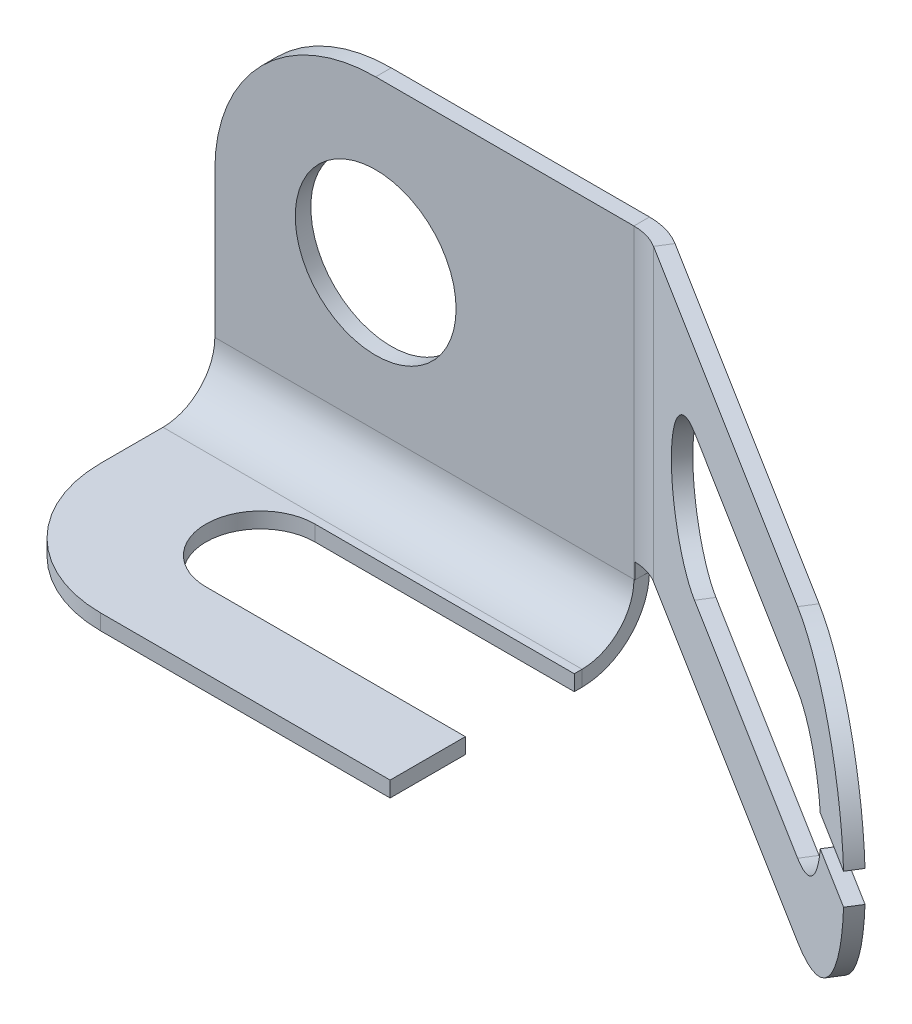
ISO-10303-21;
HEADER;
FILE_DESCRIPTION(('STEP AP214'),'2;1');
FILE_NAME('part.step','',(''),(''),'','','');
FILE_SCHEMA(('AUTOMOTIVE_DESIGN { 1 0 10303 214 1 1 1 1 }'));
ENDSEC;
DATA;
#1=APPLICATION_CONTEXT('core data for automotive mechanical design processes');
#2=APPLICATION_PROTOCOL_DEFINITION('international standard','automotive_design',2000,#1);
#3=PRODUCT_CONTEXT('',#1,'mechanical');
#4=PRODUCT('Part','Part','',(#3));
#5=PRODUCT_RELATED_PRODUCT_CATEGORY('part','',(#4));
#6=PRODUCT_DEFINITION_FORMATION('','',#4);
#7=PRODUCT_DEFINITION_CONTEXT('part definition',#1,'design');
#8=PRODUCT_DEFINITION('design','',#6,#7);
#9=PRODUCT_DEFINITION_SHAPE('','',#8);
#10=(LENGTH_UNIT() NAMED_UNIT(*) SI_UNIT(.MILLI.,.METRE.));
#11=(NAMED_UNIT(*) PLANE_ANGLE_UNIT() SI_UNIT($,.RADIAN.));
#12=(NAMED_UNIT(*) SI_UNIT($,.STERADIAN.) SOLID_ANGLE_UNIT());
#13=UNCERTAINTY_MEASURE_WITH_UNIT(LENGTH_MEASURE(1.E-05),#10,'distance_accuracy_value','');
#14=(GEOMETRIC_REPRESENTATION_CONTEXT(3) GLOBAL_UNCERTAINTY_ASSIGNED_CONTEXT((#13)) GLOBAL_UNIT_ASSIGNED_CONTEXT((#10,
#11,#12)) REPRESENTATION_CONTEXT('',''));
#15=CARTESIAN_POINT('',(0.,0.,0.));
#16=DIRECTION('',(0.,0.,1.));
#17=DIRECTION('',(1.,0.,0.));
#18=AXIS2_PLACEMENT_3D('',#15,#16,#17);
#19=CARTESIAN_POINT('',(9.95771883526609,-8.19999999999999,0.));
#20=DIRECTION('',(1.,0.,0.));
#21=DIRECTION('',(0.,0.,-1.));
#22=AXIS2_PLACEMENT_3D('',#19,#20,#21);
#23=PLANE('',#22);
#24=DIRECTION('',(0.,1.,0.));
#25=VECTOR('',#24,1.);
#26=CARTESIAN_POINT('',(9.95771883526609,-8.20000000000002,6.5));
#27=LINE('',#26,#25);
#28=CARTESIAN_POINT('',(9.95771883526609,-8.20000000000002,6.5));
#29=VERTEX_POINT('',#28);
#30=CARTESIAN_POINT('',(9.95771883526609,-7.60000000000001,6.5));
#31=VERTEX_POINT('',#30);
#32=EDGE_CURVE('E302',#29,#31,#27,.T.);
#33=ORIENTED_EDGE('',*,*,#32,.T.);
#34=DIRECTION('',(0.,0.,1.));
#35=VECTOR('',#34,1.);
#36=CARTESIAN_POINT('',(9.95771883526609,-7.59999999999999,0.));
#37=LINE('',#36,#35);
#38=CARTESIAN_POINT('',(9.95771883526609,-7.60000000000003,9.4));
#39=VERTEX_POINT('',#38);
#40=EDGE_CURVE('E285',#39,#31,#37,.F.);
#41=ORIENTED_EDGE('',*,*,#40,.F.);
#42=DIRECTION('',(0.,1.,0.));
#43=VECTOR('',#42,1.);
#44=CARTESIAN_POINT('',(9.95771883526609,-8.20000000000002,9.4));
#45=LINE('',#44,#43);
#46=CARTESIAN_POINT('',(9.95771883526609,-8.20000000000002,9.4));
#47=VERTEX_POINT('',#46);
#48=EDGE_CURVE('E278',#47,#39,#45,.T.);
#49=ORIENTED_EDGE('',*,*,#48,.F.);
#50=DIRECTION('',(0.,0.,-1.));
#51=VECTOR('',#50,1.);
#52=CARTESIAN_POINT('',(9.95771883526609,-8.19999999999999,0.));
#53=LINE('',#52,#51);
#54=EDGE_CURVE('E274',#47,#29,#53,.T.);
#55=ORIENTED_EDGE('',*,*,#54,.T.);
#56=EDGE_LOOP('',(#33,#41,#49,#55));
#57=FACE_BOUND('',#56,.T.);
#58=ADVANCED_FACE('F65',(#57),#23,.T.);
#59=CARTESIAN_POINT('',(-6.2,0.,-0.6));
#60=DIRECTION('',(-1.,0.,0.));
#61=DIRECTION('',(0.,-1.,0.));
#62=AXIS2_PLACEMENT_3D('',#59,#60,#61);
#63=PLANE('',#62);
#64=DIRECTION('',(0.,-1.,0.));
#65=VECTOR('',#64,1.);
#66=CARTESIAN_POINT('',(-6.2,0.,-0.6));
#67=LINE('',#66,#65);
#68=CARTESIAN_POINT('',(-6.2,0.,-0.6));
#69=VERTEX_POINT('',#68);
#70=CARTESIAN_POINT('',(-6.2,-5.6,-0.6));
#71=VERTEX_POINT('',#70);
#72=EDGE_CURVE('E375',#69,#71,#67,.T.);
#73=ORIENTED_EDGE('',*,*,#72,.T.);
#74=DIRECTION('',(0.,0.,-1.));
#75=VECTOR('',#74,1.);
#76=CARTESIAN_POINT('',(-6.2,-5.6,0.));
#77=LINE('',#76,#75);
#78=CARTESIAN_POINT('',(-6.2,-5.6,0.));
#79=VERTEX_POINT('',#78);
#80=EDGE_CURVE('E319',#71,#79,#77,.F.);
#81=ORIENTED_EDGE('',*,*,#80,.T.);
#82=DIRECTION('',(0.,-1.,0.));
#83=VECTOR('',#82,1.);
#84=CARTESIAN_POINT('',(-6.2,0.,0.));
#85=LINE('',#84,#83);
#86=CARTESIAN_POINT('',(-6.2,0.,0.));
#87=VERTEX_POINT('',#86);
#88=EDGE_CURVE('E362',#87,#79,#85,.T.);
#89=ORIENTED_EDGE('',*,*,#88,.F.);
#90=DIRECTION('',(0.,0.,1.));
#91=VECTOR('',#90,1.);
#92=CARTESIAN_POINT('',(-6.2,0.,-0.6));
#93=LINE('',#92,#91);
#94=EDGE_CURVE('E378',#69,#87,#93,.T.);
#95=ORIENTED_EDGE('',*,*,#94,.F.);
#96=EDGE_LOOP('',(#73,#81,#89,#95));
#97=FACE_BOUND('',#96,.T.);
#98=ADVANCED_FACE('F514',(#97),#63,.T.);
#99=CARTESIAN_POINT('',(0.,0.,-0.6));
#100=DIRECTION('',(0.,0.,1.));
#101=DIRECTION('',(1.,0.,0.));
#102=AXIS2_PLACEMENT_3D('',#99,#100,#101);
#103=PLANE('',#102);
#104=CARTESIAN_POINT('',(0.,0.,-0.6));
#105=DIRECTION('',(0.,0.,1.));
#106=DIRECTION('',(1.,0.,0.));
#107=AXIS2_PLACEMENT_3D('',#104,#105,#106);
#108=CIRCLE('',#107,3.1);
#109=CARTESIAN_POINT('',(3.1,0.,-0.6));
#110=VERTEX_POINT('',#109);
#111=EDGE_CURVE('E372',#110,#110,#108,.T.);
#112=ORIENTED_EDGE('',*,*,#111,.T.);
#113=EDGE_LOOP('',(#112));
#114=FACE_BOUND('',#113,.T.);
#115=DIRECTION('',(-1.,0.,0.));
#116=VECTOR('',#115,1.);
#117=CARTESIAN_POINT('',(1.9,-5.6,-0.6));
#118=LINE('',#117,#116);
#119=CARTESIAN_POINT('',(9.95771883526609,-5.6,-0.6));
#120=VERTEX_POINT('',#119);
#121=EDGE_CURVE('E306',#71,#120,#118,.F.);
#122=ORIENTED_EDGE('',*,*,#121,.F.);
#123=ORIENTED_EDGE('',*,*,#72,.F.);
#124=CARTESIAN_POINT('',(0.,0.,-0.6));
#125=DIRECTION('',(0.,0.,1.));
#126=DIRECTION('',(1.,0.,0.));
#127=AXIS2_PLACEMENT_3D('',#124,#125,#126);
#128=CIRCLE('',#127,6.2);
#129=CARTESIAN_POINT('',(0.,6.2,-0.6));
#130=VERTEX_POINT('',#129);
#131=EDGE_CURVE('E380',#130,#69,#128,.T.);
#132=ORIENTED_EDGE('',*,*,#131,.F.);
#133=DIRECTION('',(-1.,0.,0.));
#134=VECTOR('',#133,1.);
#135=CARTESIAN_POINT('',(0.,6.2,-0.6));
#136=LINE('',#135,#134);
#137=CARTESIAN_POINT('',(9.95771883526609,6.2,-0.6));
#138=VERTEX_POINT('',#137);
#139=EDGE_CURVE('E357',#138,#130,#136,.T.);
#140=ORIENTED_EDGE('',*,*,#139,.F.);
#141=DIRECTION('',(0.,1.,0.));
#142=VECTOR('',#141,1.);
#143=CARTESIAN_POINT('',(9.95771883526609,0.,-0.6));
#144=LINE('',#143,#142);
#145=EDGE_CURVE('E352',#120,#138,#144,.T.);
#146=ORIENTED_EDGE('',*,*,#145,.F.);
#147=EDGE_LOOP('',(#122,#123,#132,#140,#146));
#148=FACE_BOUND('',#147,.T.);
#149=ADVANCED_FACE('F509',(#114,#148),#103,.F.);
#150=CARTESIAN_POINT('',(0.,0.,0.));
#151=DIRECTION('',(0.,0.,1.));
#152=DIRECTION('',(1.,0.,0.));
#153=AXIS2_PLACEMENT_3D('',#150,#151,#152);
#154=PLANE('',#153);
#155=CARTESIAN_POINT('',(0.,0.,0.));
#156=DIRECTION('',(0.,0.,1.));
#157=DIRECTION('',(1.,0.,0.));
#158=AXIS2_PLACEMENT_3D('',#155,#156,#157);
#159=CIRCLE('',#158,3.1);
#160=CARTESIAN_POINT('',(3.1,0.,0.));
#161=VERTEX_POINT('',#160);
#162=EDGE_CURVE('E383',#161,#161,#159,.T.);
#163=ORIENTED_EDGE('',*,*,#162,.F.);
#164=EDGE_LOOP('',(#163));
#165=FACE_BOUND('',#164,.T.);
#166=ORIENTED_EDGE('',*,*,#88,.T.);
#167=DIRECTION('',(1.,0.,0.));
#168=VECTOR('',#167,1.);
#169=CARTESIAN_POINT('',(-6.2,-5.6,0.));
#170=LINE('',#169,#168);
#171=CARTESIAN_POINT('',(9.95771883526609,-5.6,0.));
#172=VERTEX_POINT('',#171);
#173=EDGE_CURVE('E316',#79,#172,#170,.T.);
#174=ORIENTED_EDGE('',*,*,#173,.T.);
#175=DIRECTION('',(0.,1.,0.));
#176=VECTOR('',#175,1.);
#177=CARTESIAN_POINT('',(9.95771883526609,0.,0.));
#178=LINE('',#177,#176);
#179=CARTESIAN_POINT('',(9.95771883526609,6.2,0.));
#180=VERTEX_POINT('',#179);
#181=EDGE_CURVE('E370',#172,#180,#178,.T.);
#182=ORIENTED_EDGE('',*,*,#181,.T.);
#183=DIRECTION('',(-1.,0.,0.));
#184=VECTOR('',#183,1.);
#185=CARTESIAN_POINT('',(0.,6.2,0.));
#186=LINE('',#185,#184);
#187=CARTESIAN_POINT('',(0.,6.2,0.));
#188=VERTEX_POINT('',#187);
#189=EDGE_CURVE('E368',#180,#188,#186,.T.);
#190=ORIENTED_EDGE('',*,*,#189,.T.);
#191=CARTESIAN_POINT('',(0.,0.,0.));
#192=DIRECTION('',(0.,0.,1.));
#193=DIRECTION('',(1.,0.,0.));
#194=AXIS2_PLACEMENT_3D('',#191,#192,#193);
#195=CIRCLE('',#194,6.2);
#196=EDGE_CURVE('E365',#188,#87,#195,.T.);
#197=ORIENTED_EDGE('',*,*,#196,.T.);
#198=EDGE_LOOP('',(#166,#174,#182,#190,#197));
#199=FACE_BOUND('',#198,.T.);
#200=ADVANCED_FACE('F574',(#165,#199),#154,.T.);
#201=CARTESIAN_POINT('',(10.005512242549,-6.45,-0.599560691774726));
#202=DIRECTION('',(0.999831035297972,0.,0.018382079724184));
#203=DIRECTION('',(0.,-1.,0.));
#204=AXIS2_PLACEMENT_3D('',#201,#202,#203);
#205=PLANE('',#204);
#206=DIRECTION('',(0.,-1.,0.));
#207=VECTOR('',#206,1.);
#208=CARTESIAN_POINT('',(9.99448299471445,13.3211008880146,0.000337929404056747));
#209=LINE('',#208,#207);
#210=CARTESIAN_POINT('',(9.99448299471445,-5.,0.000337929404056747));
#211=VERTEX_POINT('',#210);
#212=CARTESIAN_POINT('',(9.99448299471445,-5.6,0.000337929404056747));
#213=VERTEX_POINT('',#212);
#214=EDGE_CURVE('E337',#211,#213,#209,.T.);
#215=ORIENTED_EDGE('',*,*,#214,.T.);
#216=DIRECTION('',(0.018382079724184,0.,-0.999831035297972));
#217=VECTOR('',#216,1.);
#218=CARTESIAN_POINT('',(10.005512242549,-5.6,-0.599560691774726));
#219=LINE('',#218,#217);
#220=CARTESIAN_POINT('',(10.005512242549,-5.6,-0.599560691774726));
#221=VERTEX_POINT('',#220);
#222=EDGE_CURVE('E326',#221,#213,#219,.F.);
#223=ORIENTED_EDGE('',*,*,#222,.F.);
#224=DIRECTION('',(0.,-1.,0.));
#225=VECTOR('',#224,1.);
#226=CARTESIAN_POINT('',(10.005512242549,-7.9,-0.599560691774726));
#227=LINE('',#226,#225);
#228=CARTESIAN_POINT('',(10.005512242549,-5.,-0.599560691774726));
#229=VERTEX_POINT('',#228);
#230=EDGE_CURVE('E340',#229,#221,#227,.T.);
#231=ORIENTED_EDGE('',*,*,#230,.F.);
#232=DIRECTION('',(0.0183820797241847,0.,-0.999831035297972));
#233=VECTOR('',#232,1.);
#234=CARTESIAN_POINT('',(10.005512242549,-5.,-0.599560691774726));
#235=LINE('',#234,#233);
#236=EDGE_CURVE('E343',#211,#229,#235,.T.);
#237=ORIENTED_EDGE('',*,*,#236,.F.);
#238=EDGE_LOOP('',(#215,#223,#231,#237));
#239=FACE_BOUND('',#238,.T.);
#240=ADVANCED_FACE('F558',(#239),#205,.T.);
#241=CARTESIAN_POINT('',(9.95771883526609,13.3211008880146,2.));
#242=DIRECTION('',(0.,-1.,0.));
#243=DIRECTION('',(0.,0.,-1.));
#244=AXIS2_PLACEMENT_3D('',#241,#242,#243);
#245=CYLINDRICAL_SURFACE('',#244,2.6);
#246=ORIENTED_EDGE('',*,*,#230,.T.);
#247=CARTESIAN_POINT('',(9.95771883526609,-5.6,2.));
#248=DIRECTION('',(0.,-1.,0.));
#249=DIRECTION('',(0.,0.,-1.));
#250=AXIS2_PLACEMENT_3D('',#247,#248,#249);
#251=CIRCLE('',#250,2.6);
#252=EDGE_CURVE('E323',#221,#120,#251,.F.);
#253=ORIENTED_EDGE('',*,*,#252,.T.);
#254=ORIENTED_EDGE('',*,*,#145,.T.);
#255=CARTESIAN_POINT('',(9.95771883526609,6.2,2.));
#256=DIRECTION('',(0.,-1.,0.));
#257=DIRECTION('',(0.,0.,1.));
#258=AXIS2_PLACEMENT_3D('',#255,#256,#257);
#259=CIRCLE('',#258,2.6);
#260=CARTESIAN_POINT('',(11.3355089222724,6.2,-0.204925050006706));
#261=VERTEX_POINT('',#260);
#262=EDGE_CURVE('E334',#138,#261,#259,.T.);
#263=ORIENTED_EDGE('',*,*,#262,.T.);
#264=DIRECTION('',(0.,1.,0.));
#265=VECTOR('',#264,1.);
#266=CARTESIAN_POINT('',(11.3355089222724,0.,-0.204925050006706));
#267=LINE('',#266,#265);
#268=CARTESIAN_POINT('',(11.3355089222724,-5.,-0.204925050006705));
#269=VERTEX_POINT('',#268);
#270=EDGE_CURVE('E446',#269,#261,#267,.T.);
#271=ORIENTED_EDGE('',*,*,#270,.F.);
#272=CARTESIAN_POINT('',(9.95771883526609,-5.,2.));
#273=DIRECTION('',(0.,1.,0.));
#274=DIRECTION('',(0.,0.,-1.));
#275=AXIS2_PLACEMENT_3D('',#272,#273,#274);
#276=CIRCLE('',#275,2.6);
#277=EDGE_CURVE('E336',#269,#229,#276,.T.);
#278=ORIENTED_EDGE('',*,*,#277,.T.);
#279=EDGE_LOOP('',(#246,#253,#254,#263,#271,#278));
#280=FACE_BOUND('',#279,.T.);
#281=ADVANCED_FACE('F554',(#280),#245,.T.);
#282=CARTESIAN_POINT('',(9.95771883526609,13.3211008880146,2.));
#283=DIRECTION('',(0.,-1.,0.));
#284=DIRECTION('',(0.,0.,-1.));
#285=AXIS2_PLACEMENT_3D('',#282,#283,#284);
#286=CYLINDRICAL_SURFACE('',#285,2.);
#287=CARTESIAN_POINT('',(9.95771883526609,-5.6,2.));
#288=DIRECTION('',(0.,-1.,0.));
#289=DIRECTION('',(0.,0.,-1.));
#290=AXIS2_PLACEMENT_3D('',#287,#288,#289);
#291=CIRCLE('',#290,2.);
#292=EDGE_CURVE('E324',#213,#172,#291,.F.);
#293=ORIENTED_EDGE('',*,*,#292,.F.);
#294=ORIENTED_EDGE('',*,*,#214,.F.);
#295=CARTESIAN_POINT('',(9.95771883526609,-5.,2.));
#296=DIRECTION('',(0.,-1.,0.));
#297=DIRECTION('',(0.,0.,-1.));
#298=AXIS2_PLACEMENT_3D('',#295,#296,#297);
#299=CIRCLE('',#298,2.);
#300=CARTESIAN_POINT('',(11.0175573637325,-5.,0.30390380768715));
#301=VERTEX_POINT('',#300);
#302=EDGE_CURVE('E344',#301,#211,#299,.F.);
#303=ORIENTED_EDGE('',*,*,#302,.F.);
#304=DIRECTION('',(0.,1.,0.));
#305=VECTOR('',#304,1.);
#306=CARTESIAN_POINT('',(11.0175573637325,0.,0.303903807687149));
#307=LINE('',#306,#305);
#308=CARTESIAN_POINT('',(11.0175573637325,6.2,0.30390380768715));
#309=VERTEX_POINT('',#308);
#310=EDGE_CURVE('E470',#301,#309,#307,.T.);
#311=ORIENTED_EDGE('',*,*,#310,.T.);
#312=CARTESIAN_POINT('',(9.95771883526609,6.2,2.));
#313=DIRECTION('',(0.,-1.,0.));
#314=DIRECTION('',(0.,0.,-1.));
#315=AXIS2_PLACEMENT_3D('',#312,#313,#314);
#316=CIRCLE('',#315,2.);
#317=EDGE_CURVE('E332',#180,#309,#316,.T.);
#318=ORIENTED_EDGE('',*,*,#317,.F.);
#319=ORIENTED_EDGE('',*,*,#181,.F.);
#320=EDGE_LOOP('',(#293,#294,#303,#311,#318,#319));
#321=FACE_BOUND('',#320,.T.);
#322=ADVANCED_FACE('F557',(#321),#286,.F.);
#323=CARTESIAN_POINT('',(1.80151378406459,0.,-6.16242641312533));
#324=DIRECTION('',(-0.529919264233206,0.,0.848048096156425));
#325=DIRECTION('',(0.848048096156425,0.,0.529919264233206));
#326=AXIS2_PLACEMENT_3D('',#323,#324,#325);
#327=PLANE('',#326);
#328=DIRECTION('',(0.848048096156425,0.,0.529919264233206));
#329=VECTOR('',#328,1.);
#330=CARTESIAN_POINT('',(10.2819947456288,-5.,-0.863233770793273));
#331=LINE('',#330,#329);
#332=CARTESIAN_POINT('',(26.140494143754,-5.,9.04625647036768));
#333=VERTEX_POINT('',#332);
#334=EDGE_CURVE('E391',#269,#333,#331,.T.);
#335=ORIENTED_EDGE('',*,*,#334,.F.);
#336=ORIENTED_EDGE('',*,*,#270,.T.);
#337=DIRECTION('',(-0.848048096156425,0.,-0.529919264233206));
#338=VECTOR('',#337,1.);
#339=CARTESIAN_POINT('',(1.80151378406459,6.2,-6.16242641312533));
#340=LINE('',#339,#338);
#341=CARTESIAN_POINT('',(26.140494143754,6.2,9.04625647036768));
#342=VERTEX_POINT('',#341);
#343=EDGE_CURVE('E415',#342,#261,#340,.T.);
#344=ORIENTED_EDGE('',*,*,#343,.F.);
#345=CARTESIAN_POINT('',(26.140494143754,0.6,9.04625647036768));
#346=DIRECTION('',(-0.529919264233206,0.,0.848048096156425));
#347=DIRECTION('',(0.848048096156425,0.,0.529919264233206));
#348=AXIS2_PLACEMENT_3D('',#345,#346,#347);
#349=CIRCLE('',#348,5.6);
#350=CARTESIAN_POINT('',(30.8622261114996,1.2,11.9967220649424));
#351=VERTEX_POINT('',#350);
#352=EDGE_CURVE('E412',#351,#342,#349,.T.);
#353=ORIENTED_EDGE('',*,*,#352,.F.);
#354=DIRECTION('',(0.848048096156425,0.,0.529919264233206));
#355=VECTOR('',#354,1.);
#356=CARTESIAN_POINT('',(28.4598708033311,1.2,10.4955638604713));
#357=LINE('',#356,#355);
#358=CARTESIAN_POINT('',(28.4598708033311,1.2,10.4955638604713));
#359=VERTEX_POINT('',#358);
#360=EDGE_CURVE('E409',#359,#351,#357,.T.);
#361=ORIENTED_EDGE('',*,*,#360,.F.);
#362=CARTESIAN_POINT('',(26.140494143754,0.6,9.04625647036768));
#363=DIRECTION('',(0.529919264233206,0.,-0.848048096156425));
#364=DIRECTION('',(0.848048096156425,0.,0.529919264233206));
#365=AXIS2_PLACEMENT_3D('',#362,#363,#364);
#366=CIRCLE('',#365,2.8);
#367=CARTESIAN_POINT('',(26.140494143754,3.4,9.04625647036768));
#368=VERTEX_POINT('',#367);
#369=EDGE_CURVE('E406',#368,#359,#366,.T.);
#370=ORIENTED_EDGE('',*,*,#369,.F.);
#371=DIRECTION('',(0.848048096156425,0.,0.529919264233206));
#372=VECTOR('',#371,1.);
#373=CARTESIAN_POINT('',(15.5398929417987,3.4,2.4222656674526));
#374=LINE('',#373,#372);
#375=CARTESIAN_POINT('',(15.5398929417987,3.4,2.4222656674526));
#376=VERTEX_POINT('',#375);
#377=EDGE_CURVE('E403',#376,#368,#374,.T.);
#378=ORIENTED_EDGE('',*,*,#377,.F.);
#379=CARTESIAN_POINT('',(15.5398929417987,0.600000000000001,2.42226566745261));
#380=DIRECTION('',(0.529919264233206,0.,-0.848048096156425));
#381=DIRECTION('',(0.848048096156425,0.,0.529919264233206));
#382=AXIS2_PLACEMENT_3D('',#379,#380,#381);
#383=CIRCLE('',#382,2.8);
#384=CARTESIAN_POINT('',(15.5398929417987,-2.2,2.4222656674526));
#385=VERTEX_POINT('',#384);
#386=EDGE_CURVE('E400',#385,#376,#383,.T.);
#387=ORIENTED_EDGE('',*,*,#386,.F.);
#388=DIRECTION('',(-0.848048096156425,0.,-0.529919264233206));
#389=VECTOR('',#388,1.);
#390=CARTESIAN_POINT('',(15.5398929417987,-2.2,2.4222656674526));
#391=LINE('',#390,#389);
#392=CARTESIAN_POINT('',(26.140494143754,-2.2,9.04625647036768));
#393=VERTEX_POINT('',#392);
#394=EDGE_CURVE('E397',#393,#385,#391,.T.);
#395=ORIENTED_EDGE('',*,*,#394,.F.);
#396=CARTESIAN_POINT('',(26.140494143754,0.6,9.04625647036768));
#397=DIRECTION('',(0.529919264233206,0.,-0.848048096156425));
#398=DIRECTION('',(0.848048096156425,0.,0.529919264233206));
#399=AXIS2_PLACEMENT_3D('',#396,#397,#398);
#400=CIRCLE('',#399,2.8);
#401=CARTESIAN_POINT('',(28.4598708033311,0.,10.4955638604713));
#402=VERTEX_POINT('',#401);
#403=EDGE_CURVE('E394',#402,#393,#400,.T.);
#404=ORIENTED_EDGE('',*,*,#403,.F.);
#405=DIRECTION('',(-0.848048096156425,0.,-0.529919264233206));
#406=VECTOR('',#405,1.);
#407=CARTESIAN_POINT('',(28.4598708033311,0.,10.4955638604713));
#408=LINE('',#407,#406);
#409=CARTESIAN_POINT('',(30.8622261114996,0.,11.9967220649424));
#410=VERTEX_POINT('',#409);
#411=EDGE_CURVE('E390',#410,#402,#408,.T.);
#412=ORIENTED_EDGE('',*,*,#411,.F.);
#413=CARTESIAN_POINT('',(26.140494143754,0.6,9.04625647036768));
#414=DIRECTION('',(-0.529919264233206,0.,0.848048096156425));
#415=DIRECTION('',(0.848048096156425,0.,0.529919264233206));
#416=AXIS2_PLACEMENT_3D('',#413,#414,#415);
#417=CIRCLE('',#416,5.6);
#418=EDGE_CURVE('E387',#333,#410,#417,.T.);
#419=ORIENTED_EDGE('',*,*,#418,.F.);
#420=EDGE_LOOP('',(#335,#336,#344,#353,#361,#370,#378,#387,#395,#404,#412,#419));
#421=FACE_BOUND('',#420,.T.);
#422=ADVANCED_FACE('F562',(#421),#327,.F.);
#423=CARTESIAN_POINT('',(1.80151378406459,6.2,-6.16242641312533));
#424=DIRECTION('',(0.,1.,0.));
#425=DIRECTION('',(-0.848048096156425,0.,-0.529919264233206));
#426=AXIS2_PLACEMENT_3D('',#423,#424,#425);
#427=PLANE('',#426);
#428=DIRECTION('',(0.529919264233206,0.,-0.848048096156425));
#429=VECTOR('',#428,1.);
#430=CARTESIAN_POINT('',(11.3355089222724,6.2,-0.204925050006706));
#431=LINE('',#430,#429);
#432=EDGE_CURVE('E472',#309,#261,#431,.T.);
#433=ORIENTED_EDGE('',*,*,#432,.F.);
#434=DIRECTION('',(-0.848048096156425,0.,-0.529919264233206));
#435=VECTOR('',#434,1.);
#436=CARTESIAN_POINT('',(1.48356222552466,6.2,-5.65359755543148));
#437=LINE('',#436,#435);
#438=CARTESIAN_POINT('',(25.8225425852141,6.2,9.55508532806153));
#439=VERTEX_POINT('',#438);
#440=EDGE_CURVE('E443',#439,#309,#437,.T.);
#441=ORIENTED_EDGE('',*,*,#440,.F.);
#442=DIRECTION('',(-0.529919264233206,0.,0.848048096156425));
#443=VECTOR('',#442,1.);
#444=CARTESIAN_POINT('',(26.140494143754,6.2,9.04625647036768));
#445=LINE('',#444,#443);
#446=EDGE_CURVE('E444',#342,#439,#445,.T.);
#447=ORIENTED_EDGE('',*,*,#446,.F.);
#448=ORIENTED_EDGE('',*,*,#343,.T.);
#449=EDGE_LOOP('',(#433,#441,#447,#448));
#450=FACE_BOUND('',#449,.T.);
#451=ADVANCED_FACE('F598',(#450),#427,.T.);
#452=CARTESIAN_POINT('',(26.140494143754,0.6,9.04625647036768));
#453=DIRECTION('',(-0.529919264233206,0.,0.848048096156425));
#454=DIRECTION('',(0.848048096156425,0.,0.529919264233206));
#455=AXIS2_PLACEMENT_3D('',#452,#453,#454);
#456=CYLINDRICAL_SURFACE('',#455,5.6);
#457=CARTESIAN_POINT('',(25.8225425852141,0.6,9.55508532806153));
#458=DIRECTION('',(-0.529919264233206,0.,0.848048096156425));
#459=DIRECTION('',(0.848048096156425,0.,0.529919264233206));
#460=AXIS2_PLACEMENT_3D('',#457,#458,#459);
#461=CIRCLE('',#460,5.6);
#462=CARTESIAN_POINT('',(30.5442745529597,1.2,12.5055509226363));
#463=VERTEX_POINT('',#462);
#464=EDGE_CURVE('E440',#463,#439,#461,.T.);
#465=ORIENTED_EDGE('',*,*,#464,.F.);
#466=DIRECTION('',(-0.529919264233206,0.,0.848048096156425));
#467=VECTOR('',#466,1.);
#468=CARTESIAN_POINT('',(30.8622261114996,1.2,11.9967220649424));
#469=LINE('',#468,#467);
#470=EDGE_CURVE('E447',#351,#463,#469,.T.);
#471=ORIENTED_EDGE('',*,*,#470,.F.);
#472=ORIENTED_EDGE('',*,*,#352,.T.);
#473=ORIENTED_EDGE('',*,*,#446,.T.);
#474=EDGE_LOOP('',(#465,#471,#472,#473));
#475=FACE_BOUND('',#474,.T.);
#476=ADVANCED_FACE('F594',(#475),#456,.T.);
#477=CARTESIAN_POINT('',(28.4598708033311,1.2,10.4955638604713));
#478=DIRECTION('',(0.,-1.,0.));
#479=DIRECTION('',(0.529919264233206,0.,-0.848048096156425));
#480=AXIS2_PLACEMENT_3D('',#477,#478,#479);
#481=PLANE('',#480);
#482=DIRECTION('',(0.848048096156425,0.,0.529919264233206));
#483=VECTOR('',#482,1.);
#484=CARTESIAN_POINT('',(28.1419192447912,1.2,11.0043927181651));
#485=LINE('',#484,#483);
#486=CARTESIAN_POINT('',(28.1419192447912,1.2,11.0043927181651));
#487=VERTEX_POINT('',#486);
#488=EDGE_CURVE('E437',#487,#463,#485,.T.);
#489=ORIENTED_EDGE('',*,*,#488,.F.);
#490=DIRECTION('',(-0.529919264233206,0.,0.848048096156425));
#491=VECTOR('',#490,1.);
#492=CARTESIAN_POINT('',(28.4598708033311,1.2,10.4955638604713));
#493=LINE('',#492,#491);
#494=EDGE_CURVE('E449',#359,#487,#493,.T.);
#495=ORIENTED_EDGE('',*,*,#494,.F.);
#496=ORIENTED_EDGE('',*,*,#360,.T.);
#497=ORIENTED_EDGE('',*,*,#470,.T.);
#498=EDGE_LOOP('',(#489,#495,#496,#497));
#499=FACE_BOUND('',#498,.T.);
#500=ADVANCED_FACE('F597',(#499),#481,.T.);
#501=CARTESIAN_POINT('',(26.140494143754,0.6,9.04625647036768));
#502=DIRECTION('',(-0.529919264233206,0.,0.848048096156425));
#503=DIRECTION('',(0.848048096156425,0.,0.529919264233206));
#504=AXIS2_PLACEMENT_3D('',#501,#502,#503);
#505=CYLINDRICAL_SURFACE('',#504,2.8);
#506=CARTESIAN_POINT('',(25.8225425852141,0.6,9.55508532806153));
#507=DIRECTION('',(0.529919264233206,0.,-0.848048096156425));
#508=DIRECTION('',(0.848048096156425,0.,0.529919264233206));
#509=AXIS2_PLACEMENT_3D('',#506,#507,#508);
#510=CIRCLE('',#509,2.8);
#511=CARTESIAN_POINT('',(25.8225425852141,3.4,9.55508532806153));
#512=VERTEX_POINT('',#511);
#513=EDGE_CURVE('E434',#512,#487,#510,.T.);
#514=ORIENTED_EDGE('',*,*,#513,.F.);
#515=DIRECTION('',(-0.529919264233206,0.,0.848048096156425));
#516=VECTOR('',#515,1.);
#517=CARTESIAN_POINT('',(26.140494143754,3.4,9.04625647036768));
#518=LINE('',#517,#516);
#519=EDGE_CURVE('E451',#368,#512,#518,.T.);
#520=ORIENTED_EDGE('',*,*,#519,.F.);
#521=ORIENTED_EDGE('',*,*,#369,.T.);
#522=ORIENTED_EDGE('',*,*,#494,.T.);
#523=EDGE_LOOP('',(#514,#520,#521,#522));
#524=FACE_BOUND('',#523,.T.);
#525=ADVANCED_FACE('F602',(#524),#505,.F.);
#526=CARTESIAN_POINT('',(15.5398929417987,3.4,2.4222656674526));
#527=DIRECTION('',(0.,-1.,0.));
#528=DIRECTION('',(0.848048096156425,0.,0.529919264233206));
#529=AXIS2_PLACEMENT_3D('',#526,#527,#528);
#530=PLANE('',#529);
#531=DIRECTION('',(0.848048096156425,0.,0.529919264233206));
#532=VECTOR('',#531,1.);
#533=CARTESIAN_POINT('',(15.2219413832588,3.4,2.93109452514646));
#534=LINE('',#533,#532);
#535=CARTESIAN_POINT('',(15.2219413832588,3.4,2.93109452514646));
#536=VERTEX_POINT('',#535);
#537=EDGE_CURVE('E431',#536,#512,#534,.T.);
#538=ORIENTED_EDGE('',*,*,#537,.F.);
#539=DIRECTION('',(-0.529919264233206,0.,0.848048096156425));
#540=VECTOR('',#539,1.);
#541=CARTESIAN_POINT('',(15.5398929417987,3.4,2.4222656674526));
#542=LINE('',#541,#540);
#543=EDGE_CURVE('E453',#376,#536,#542,.T.);
#544=ORIENTED_EDGE('',*,*,#543,.F.);
#545=ORIENTED_EDGE('',*,*,#377,.T.);
#546=ORIENTED_EDGE('',*,*,#519,.T.);
#547=EDGE_LOOP('',(#538,#544,#545,#546));
#548=FACE_BOUND('',#547,.T.);
#549=ADVANCED_FACE('F606',(#548),#530,.T.);
#550=CARTESIAN_POINT('',(15.5398929417987,0.600000000000001,2.42226566745261));
#551=DIRECTION('',(-0.529919264233206,0.,0.848048096156425));
#552=DIRECTION('',(0.848048096156425,0.,0.529919264233206));
#553=AXIS2_PLACEMENT_3D('',#550,#551,#552);
#554=CYLINDRICAL_SURFACE('',#553,2.8);
#555=CARTESIAN_POINT('',(15.2219413832588,0.600000000000001,2.93109452514646));
#556=DIRECTION('',(0.529919264233206,0.,-0.848048096156425));
#557=DIRECTION('',(0.848048096156425,0.,0.529919264233206));
#558=AXIS2_PLACEMENT_3D('',#555,#556,#557);
#559=CIRCLE('',#558,2.8);
#560=CARTESIAN_POINT('',(15.2219413832587,-2.2,2.93109452514646));
#561=VERTEX_POINT('',#560);
#562=EDGE_CURVE('E428',#561,#536,#559,.T.);
#563=ORIENTED_EDGE('',*,*,#562,.F.);
#564=DIRECTION('',(-0.529919264233206,0.,0.848048096156425));
#565=VECTOR('',#564,1.);
#566=CARTESIAN_POINT('',(15.5398929417987,-2.2,2.4222656674526));
#567=LINE('',#566,#565);
#568=EDGE_CURVE('E455',#385,#561,#567,.T.);
#569=ORIENTED_EDGE('',*,*,#568,.F.);
#570=ORIENTED_EDGE('',*,*,#386,.T.);
#571=ORIENTED_EDGE('',*,*,#543,.T.);
#572=EDGE_LOOP('',(#563,#569,#570,#571));
#573=FACE_BOUND('',#572,.T.);
#574=ADVANCED_FACE('F610',(#573),#554,.F.);
#575=CARTESIAN_POINT('',(15.5398929417987,-2.2,2.4222656674526));
#576=DIRECTION('',(0.,1.,0.));
#577=DIRECTION('',(-0.848048096156425,0.,-0.529919264233206));
#578=AXIS2_PLACEMENT_3D('',#575,#576,#577);
#579=PLANE('',#578);
#580=DIRECTION('',(-0.848048096156425,0.,-0.529919264233206));
#581=VECTOR('',#580,1.);
#582=CARTESIAN_POINT('',(15.2219413832588,-2.2,2.93109452514646));
#583=LINE('',#582,#581);
#584=CARTESIAN_POINT('',(25.8225425852141,-2.2,9.55508532806153));
#585=VERTEX_POINT('',#584);
#586=EDGE_CURVE('E425',#585,#561,#583,.T.);
#587=ORIENTED_EDGE('',*,*,#586,.F.);
#588=DIRECTION('',(-0.529919264233206,0.,0.848048096156425));
#589=VECTOR('',#588,1.);
#590=CARTESIAN_POINT('',(26.140494143754,-2.2,9.04625647036768));
#591=LINE('',#590,#589);
#592=EDGE_CURVE('E457',#393,#585,#591,.T.);
#593=ORIENTED_EDGE('',*,*,#592,.F.);
#594=ORIENTED_EDGE('',*,*,#394,.T.);
#595=ORIENTED_EDGE('',*,*,#568,.T.);
#596=EDGE_LOOP('',(#587,#593,#594,#595));
#597=FACE_BOUND('',#596,.T.);
#598=ADVANCED_FACE('F614',(#597),#579,.T.);
#599=CARTESIAN_POINT('',(26.140494143754,0.6,9.04625647036768));
#600=DIRECTION('',(-0.529919264233206,0.,0.848048096156425));
#601=DIRECTION('',(0.848048096156425,0.,0.529919264233206));
#602=AXIS2_PLACEMENT_3D('',#599,#600,#601);
#603=CYLINDRICAL_SURFACE('',#602,2.8);
#604=CARTESIAN_POINT('',(25.8225425852141,0.6,9.55508532806153));
#605=DIRECTION('',(0.529919264233206,0.,-0.848048096156425));
#606=DIRECTION('',(0.848048096156425,0.,0.529919264233206));
#607=AXIS2_PLACEMENT_3D('',#604,#605,#606);
#608=CIRCLE('',#607,2.8);
#609=CARTESIAN_POINT('',(28.1419192447912,0.,11.0043927181651));
#610=VERTEX_POINT('',#609);
#611=EDGE_CURVE('E422',#610,#585,#608,.T.);
#612=ORIENTED_EDGE('',*,*,#611,.F.);
#613=DIRECTION('',(-0.529919264233206,0.,0.848048096156425));
#614=VECTOR('',#613,1.);
#615=CARTESIAN_POINT('',(28.4598708033311,0.,10.4955638604713));
#616=LINE('',#615,#614);
#617=EDGE_CURVE('E459',#402,#610,#616,.T.);
#618=ORIENTED_EDGE('',*,*,#617,.F.);
#619=ORIENTED_EDGE('',*,*,#403,.T.);
#620=ORIENTED_EDGE('',*,*,#592,.T.);
#621=EDGE_LOOP('',(#612,#618,#619,#620));
#622=FACE_BOUND('',#621,.T.);
#623=ADVANCED_FACE('F618',(#622),#603,.F.);
#624=CARTESIAN_POINT('',(28.4598708033311,0.,10.4955638604713));
#625=DIRECTION('',(0.,1.,0.));
#626=DIRECTION('',(-0.529919264233206,0.,0.848048096156425));
#627=AXIS2_PLACEMENT_3D('',#624,#625,#626);
#628=PLANE('',#627);
#629=DIRECTION('',(-0.848048096156425,0.,-0.529919264233206));
#630=VECTOR('',#629,1.);
#631=CARTESIAN_POINT('',(28.1419192447912,0.,11.0043927181651));
#632=LINE('',#631,#630);
#633=CARTESIAN_POINT('',(30.5442745529597,0.,12.5055509226363));
#634=VERTEX_POINT('',#633);
#635=EDGE_CURVE('E419',#634,#610,#632,.T.);
#636=ORIENTED_EDGE('',*,*,#635,.F.);
#637=DIRECTION('',(-0.529919264233206,0.,0.848048096156425));
#638=VECTOR('',#637,1.);
#639=CARTESIAN_POINT('',(30.8622261114996,0.,11.9967220649424));
#640=LINE('',#639,#638);
#641=EDGE_CURVE('E461',#410,#634,#640,.T.);
#642=ORIENTED_EDGE('',*,*,#641,.F.);
#643=ORIENTED_EDGE('',*,*,#411,.T.);
#644=ORIENTED_EDGE('',*,*,#617,.T.);
#645=EDGE_LOOP('',(#636,#642,#643,#644));
#646=FACE_BOUND('',#645,.T.);
#647=ADVANCED_FACE('F622',(#646),#628,.T.);
#648=CARTESIAN_POINT('',(26.140494143754,0.6,9.04625647036768));
#649=DIRECTION('',(-0.529919264233206,0.,0.848048096156425));
#650=DIRECTION('',(0.848048096156425,0.,0.529919264233206));
#651=AXIS2_PLACEMENT_3D('',#648,#649,#650);
#652=CYLINDRICAL_SURFACE('',#651,5.6);
#653=CARTESIAN_POINT('',(25.8225425852141,0.6,9.55508532806153));
#654=DIRECTION('',(-0.529919264233206,0.,0.848048096156425));
#655=DIRECTION('',(0.848048096156425,0.,0.529919264233206));
#656=AXIS2_PLACEMENT_3D('',#653,#654,#655);
#657=CIRCLE('',#656,5.6);
#658=CARTESIAN_POINT('',(25.8225425852141,-5.,9.55508532806153));
#659=VERTEX_POINT('',#658);
#660=EDGE_CURVE('E416',#659,#634,#657,.T.);
#661=ORIENTED_EDGE('',*,*,#660,.F.);
#662=DIRECTION('',(-0.529919264233206,0.,0.848048096156425));
#663=VECTOR('',#662,1.);
#664=CARTESIAN_POINT('',(26.140494143754,-5.,9.04625647036768));
#665=LINE('',#664,#663);
#666=EDGE_CURVE('E463',#333,#659,#665,.T.);
#667=ORIENTED_EDGE('',*,*,#666,.F.);
#668=ORIENTED_EDGE('',*,*,#418,.T.);
#669=ORIENTED_EDGE('',*,*,#641,.T.);
#670=EDGE_LOOP('',(#661,#667,#668,#669));
#671=FACE_BOUND('',#670,.T.);
#672=ADVANCED_FACE('F626',(#671),#652,.T.);
#673=CARTESIAN_POINT('',(10.2819947456288,-5.,-0.863233770793273));
#674=DIRECTION('',(0.,-1.,0.));
#675=DIRECTION('',(0.848048096156425,0.,0.529919264233206));
#676=AXIS2_PLACEMENT_3D('',#673,#674,#675);
#677=PLANE('',#676);
#678=DIRECTION('',(-0.529919264233206,0.,0.848048096156425));
#679=VECTOR('',#678,1.);
#680=CARTESIAN_POINT('',(11.3355089222724,-5.,-0.204925050006706));
#681=LINE('',#680,#679);
#682=EDGE_CURVE('E468',#269,#301,#681,.T.);
#683=ORIENTED_EDGE('',*,*,#682,.F.);
#684=ORIENTED_EDGE('',*,*,#334,.T.);
#685=ORIENTED_EDGE('',*,*,#666,.T.);
#686=DIRECTION('',(0.848048096156425,0.,0.529919264233206));
#687=VECTOR('',#686,1.);
#688=CARTESIAN_POINT('',(9.96404318708892,-5.,-0.354404913099417));
#689=LINE('',#688,#687);
#690=EDGE_CURVE('E356',#301,#659,#689,.T.);
#691=ORIENTED_EDGE('',*,*,#690,.F.);
#692=EDGE_LOOP('',(#683,#684,#685,#691));
#693=FACE_BOUND('',#692,.T.);
#694=ADVANCED_FACE('F630',(#693),#677,.T.);
#695=CARTESIAN_POINT('',(1.48356222552466,0.,-5.65359755543148));
#696=DIRECTION('',(-0.529919264233206,0.,0.848048096156425));
#697=DIRECTION('',(0.848048096156425,0.,0.529919264233206));
#698=AXIS2_PLACEMENT_3D('',#695,#696,#697);
#699=PLANE('',#698);
#700=ORIENTED_EDGE('',*,*,#310,.F.);
#701=ORIENTED_EDGE('',*,*,#690,.T.);
#702=ORIENTED_EDGE('',*,*,#660,.T.);
#703=ORIENTED_EDGE('',*,*,#635,.T.);
#704=ORIENTED_EDGE('',*,*,#611,.T.);
#705=ORIENTED_EDGE('',*,*,#586,.T.);
#706=ORIENTED_EDGE('',*,*,#562,.T.);
#707=ORIENTED_EDGE('',*,*,#537,.T.);
#708=ORIENTED_EDGE('',*,*,#513,.T.);
#709=ORIENTED_EDGE('',*,*,#488,.T.);
#710=ORIENTED_EDGE('',*,*,#464,.T.);
#711=ORIENTED_EDGE('',*,*,#440,.T.);
#712=EDGE_LOOP('',(#700,#701,#702,#703,#704,#705,#706,#707,#708,#709,#710,#711));
#713=FACE_BOUND('',#712,.T.);
#714=ADVANCED_FACE('F580',(#713),#699,.T.);
#715=CARTESIAN_POINT('',(0.,0.,-0.6));
#716=DIRECTION('',(0.,0.,1.));
#717=DIRECTION('',(1.,0.,0.));
#718=AXIS2_PLACEMENT_3D('',#715,#716,#717);
#719=CYLINDRICAL_SURFACE('',#718,3.1);
#720=ORIENTED_EDGE('',*,*,#111,.F.);
#721=EDGE_LOOP('',(#720));
#722=FACE_BOUND('',#721,.T.);
#723=ORIENTED_EDGE('',*,*,#162,.T.);
#724=EDGE_LOOP('',(#723));
#725=FACE_BOUND('',#724,.T.);
#726=ADVANCED_FACE('F576',(#722,#725),#719,.F.);
#727=CARTESIAN_POINT('',(0.,0.,-0.6));
#728=DIRECTION('',(0.,0.,1.));
#729=DIRECTION('',(1.,0.,0.));
#730=AXIS2_PLACEMENT_3D('',#727,#728,#729);
#731=CYLINDRICAL_SURFACE('',#730,6.2);
#732=ORIENTED_EDGE('',*,*,#196,.F.);
#733=DIRECTION('',(0.,0.,1.));
#734=VECTOR('',#733,1.);
#735=CARTESIAN_POINT('',(0.,6.2,-0.6));
#736=LINE('',#735,#734);
#737=EDGE_CURVE('E353',#130,#188,#736,.T.);
#738=ORIENTED_EDGE('',*,*,#737,.F.);
#739=ORIENTED_EDGE('',*,*,#131,.T.);
#740=ORIENTED_EDGE('',*,*,#94,.T.);
#741=EDGE_LOOP('',(#732,#738,#739,#740));
#742=FACE_BOUND('',#741,.T.);
#743=ADVANCED_FACE('F579',(#742),#731,.T.);
#744=CARTESIAN_POINT('',(0.,6.2,-0.6));
#745=DIRECTION('',(0.,1.,0.));
#746=DIRECTION('',(-1.,0.,0.));
#747=AXIS2_PLACEMENT_3D('',#744,#745,#746);
#748=PLANE('',#747);
#749=ORIENTED_EDGE('',*,*,#189,.F.);
#750=DIRECTION('',(0.,0.,-1.));
#751=VECTOR('',#750,1.);
#752=CARTESIAN_POINT('',(9.95771883526609,6.2,-0.6));
#753=LINE('',#752,#751);
#754=EDGE_CURVE('E359',#180,#138,#753,.T.);
#755=ORIENTED_EDGE('',*,*,#754,.T.);
#756=ORIENTED_EDGE('',*,*,#139,.T.);
#757=ORIENTED_EDGE('',*,*,#737,.T.);
#758=EDGE_LOOP('',(#749,#755,#756,#757));
#759=FACE_BOUND('',#758,.T.);
#760=ADVANCED_FACE('F570',(#759),#748,.T.);
#761=CARTESIAN_POINT('',(9.95771883526609,6.2,2.));
#762=DIRECTION('',(0.,1.,0.));
#763=DIRECTION('',(0.,0.,1.));
#764=AXIS2_PLACEMENT_3D('',#761,#762,#763);
#765=PLANE('',#764);
#766=ORIENTED_EDGE('',*,*,#754,.F.);
#767=ORIENTED_EDGE('',*,*,#317,.T.);
#768=ORIENTED_EDGE('',*,*,#432,.T.);
#769=ORIENTED_EDGE('',*,*,#262,.F.);
#770=EDGE_LOOP('',(#766,#767,#768,#769));
#771=FACE_BOUND('',#770,.T.);
#772=ADVANCED_FACE('F566',(#771),#765,.T.);
#773=CARTESIAN_POINT('',(9.95771883526609,-5.,2.));
#774=DIRECTION('',(0.,-1.,0.));
#775=DIRECTION('',(0.,0.,-1.));
#776=AXIS2_PLACEMENT_3D('',#773,#774,#775);
#777=PLANE('',#776);
#778=ORIENTED_EDGE('',*,*,#682,.T.);
#779=ORIENTED_EDGE('',*,*,#302,.T.);
#780=ORIENTED_EDGE('',*,*,#236,.T.);
#781=ORIENTED_EDGE('',*,*,#277,.F.);
#782=EDGE_LOOP('',(#778,#779,#780,#781));
#783=FACE_BOUND('',#782,.T.);
#784=ADVANCED_FACE('F553',(#783),#777,.T.);
#785=CARTESIAN_POINT('',(9.95771883526609,-5.6,2.));
#786=DIRECTION('',(0.,1.,0.));
#787=DIRECTION('',(0.,0.,1.));
#788=AXIS2_PLACEMENT_3D('',#785,#786,#787);
#789=PLANE('',#788);
#790=DIRECTION('',(0.,0.,-1.));
#791=VECTOR('',#790,1.);
#792=CARTESIAN_POINT('',(9.95771883526609,-5.6,-0.6));
#793=LINE('',#792,#791);
#794=EDGE_CURVE('E329',#120,#172,#793,.F.);
#795=ORIENTED_EDGE('',*,*,#794,.F.);
#796=ORIENTED_EDGE('',*,*,#252,.F.);
#797=ORIENTED_EDGE('',*,*,#222,.T.);
#798=ORIENTED_EDGE('',*,*,#292,.T.);
#799=EDGE_LOOP('',(#795,#796,#797,#798));
#800=FACE_BOUND('',#799,.T.);
#801=ADVANCED_FACE('F501',(#800),#789,.F.);
#802=CARTESIAN_POINT('',(-6.2,-5.6,2.));
#803=DIRECTION('',(-1.,0.,0.));
#804=DIRECTION('',(0.,0.,1.));
#805=AXIS2_PLACEMENT_3D('',#802,#803,#804);
#806=PLANE('',#805);
#807=DIRECTION('',(0.,-1.,0.));
#808=VECTOR('',#807,1.);
#809=CARTESIAN_POINT('',(-6.2,-8.2,1.99999999999999));
#810=LINE('',#809,#808);
#811=CARTESIAN_POINT('',(-6.2,-7.6,1.99999999999999));
#812=VERTEX_POINT('',#811);
#813=CARTESIAN_POINT('',(-6.2,-8.2,1.99999999999999));
#814=VERTEX_POINT('',#813);
#815=EDGE_CURVE('E299',#812,#814,#810,.T.);
#816=ORIENTED_EDGE('',*,*,#815,.F.);
#817=CARTESIAN_POINT('',(-6.2,-5.6,2.));
#818=DIRECTION('',(1.,0.,0.));
#819=DIRECTION('',(0.,0.,-1.));
#820=AXIS2_PLACEMENT_3D('',#817,#818,#819);
#821=CIRCLE('',#820,2.);
#822=EDGE_CURVE('E310',#79,#812,#821,.F.);
#823=ORIENTED_EDGE('',*,*,#822,.F.);
#824=ORIENTED_EDGE('',*,*,#80,.F.);
#825=CARTESIAN_POINT('',(-6.2,-5.6,2.));
#826=DIRECTION('',(1.,0.,0.));
#827=DIRECTION('',(0.,0.,-1.));
#828=AXIS2_PLACEMENT_3D('',#825,#826,#827);
#829=CIRCLE('',#828,2.6);
#830=EDGE_CURVE('E303',#71,#814,#829,.F.);
#831=ORIENTED_EDGE('',*,*,#830,.T.);
#832=EDGE_LOOP('',(#816,#823,#824,#831));
#833=FACE_BOUND('',#832,.T.);
#834=ADVANCED_FACE('F517',(#833),#806,.T.);
#835=CARTESIAN_POINT('',(9.95771883526609,-5.6,2.));
#836=DIRECTION('',(-1.,0.,0.));
#837=DIRECTION('',(0.,0.,1.));
#838=AXIS2_PLACEMENT_3D('',#835,#836,#837);
#839=PLANE('',#838);
#840=CARTESIAN_POINT('',(9.95771883526609,-5.6,2.));
#841=DIRECTION('',(1.,0.,0.));
#842=DIRECTION('',(0.,0.,-1.));
#843=AXIS2_PLACEMENT_3D('',#840,#841,#842);
#844=CIRCLE('',#843,2.);
#845=CARTESIAN_POINT('',(9.95771883526609,-7.6,1.99999999999999));
#846=VERTEX_POINT('',#845);
#847=EDGE_CURVE('E313',#846,#172,#844,.T.);
#848=ORIENTED_EDGE('',*,*,#847,.F.);
#849=DIRECTION('',(0.,-1.,0.));
#850=VECTOR('',#849,1.);
#851=CARTESIAN_POINT('',(9.95771883526609,-7.6,1.99999999999999));
#852=LINE('',#851,#850);
#853=CARTESIAN_POINT('',(9.95771883526609,-8.2,1.99999999999999));
#854=VERTEX_POINT('',#853);
#855=EDGE_CURVE('E293',#846,#854,#852,.T.);
#856=ORIENTED_EDGE('',*,*,#855,.T.);
#857=CARTESIAN_POINT('',(9.95771883526609,-5.6,2.));
#858=DIRECTION('',(1.,0.,0.));
#859=DIRECTION('',(0.,0.,-1.));
#860=AXIS2_PLACEMENT_3D('',#857,#858,#859);
#861=CIRCLE('',#860,2.6);
#862=EDGE_CURVE('E307',#854,#120,#861,.T.);
#863=ORIENTED_EDGE('',*,*,#862,.T.);
#864=ORIENTED_EDGE('',*,*,#794,.T.);
#865=EDGE_LOOP('',(#848,#856,#863,#864));
#866=FACE_BOUND('',#865,.T.);
#867=ADVANCED_FACE('F498',(#866),#839,.F.);
#868=CARTESIAN_POINT('',(9.95771883526609,-5.6,2.));
#869=DIRECTION('',(1.,0.,0.));
#870=DIRECTION('',(0.,-1.,0.));
#871=AXIS2_PLACEMENT_3D('',#868,#869,#870);
#872=CYLINDRICAL_SURFACE('',#871,2.6);
#873=ORIENTED_EDGE('',*,*,#121,.T.);
#874=ORIENTED_EDGE('',*,*,#862,.F.);
#875=DIRECTION('',(1.,0.,0.));
#876=VECTOR('',#875,1.);
#877=CARTESIAN_POINT('',(0.,-8.2,1.99999999999999));
#878=LINE('',#877,#876);
#879=EDGE_CURVE('E273',#814,#854,#878,.T.);
#880=ORIENTED_EDGE('',*,*,#879,.F.);
#881=ORIENTED_EDGE('',*,*,#830,.F.);
#882=EDGE_LOOP('',(#873,#874,#880,#881));
#883=FACE_BOUND('',#882,.T.);
#884=ADVANCED_FACE('F506',(#883),#872,.T.);
#885=CARTESIAN_POINT('',(9.95771883526609,-5.6,2.));
#886=DIRECTION('',(1.,0.,0.));
#887=DIRECTION('',(0.,-1.,0.));
#888=AXIS2_PLACEMENT_3D('',#885,#886,#887);
#889=CYLINDRICAL_SURFACE('',#888,2.);
#890=ORIENTED_EDGE('',*,*,#173,.F.);
#891=ORIENTED_EDGE('',*,*,#822,.T.);
#892=DIRECTION('',(-1.,0.,0.));
#893=VECTOR('',#892,1.);
#894=CARTESIAN_POINT('',(-6.2,-7.6,1.99999999999999));
#895=LINE('',#894,#893);
#896=EDGE_CURVE('E296',#812,#846,#895,.F.);
#897=ORIENTED_EDGE('',*,*,#896,.T.);
#898=ORIENTED_EDGE('',*,*,#847,.T.);
#899=EDGE_LOOP('',(#890,#891,#897,#898));
#900=FACE_BOUND('',#899,.T.);
#901=ADVANCED_FACE('F495',(#900),#889,.F.);
#902=DIRECTION('',(0.,1.,0.));
#903=VECTOR('',#902,1.);
#904=CARTESIAN_POINT('',(9.95771883526608,-8.2,2.29999999999999));
#905=LINE('',#904,#903);
#906=CARTESIAN_POINT('',(9.95771883526608,-8.2,2.29999999999999));
#907=VERTEX_POINT('',#906);
#908=CARTESIAN_POINT('',(9.95771883526609,-7.6,2.3));
#909=VERTEX_POINT('',#908);
#910=EDGE_CURVE('E251',#907,#909,#905,.T.);
#911=ORIENTED_EDGE('',*,*,#910,.F.);
#912=EDGE_CURVE('E265',#907,#854,#53,.T.);
#913=ORIENTED_EDGE('',*,*,#912,.T.);
#914=ORIENTED_EDGE('',*,*,#855,.F.);
#915=EDGE_CURVE('E267',#909,#846,#37,.F.);
#916=ORIENTED_EDGE('',*,*,#915,.F.);
#917=EDGE_LOOP('',(#911,#913,#914,#916));
#918=FACE_BOUND('',#917,.T.);
#919=ADVANCED_FACE('F263',(#918),#23,.T.);
#920=CARTESIAN_POINT('',(-6.2,-8.20000000000002,9.4));
#921=DIRECTION('',(-1.,0.,0.));
#922=DIRECTION('',(0.,0.,1.));
#923=AXIS2_PLACEMENT_3D('',#920,#921,#922);
#924=PLANE('',#923);
#925=DIRECTION('',(0.,0.,1.));
#926=VECTOR('',#925,1.);
#927=CARTESIAN_POINT('',(-6.2,-8.20000000000002,9.4));
#928=LINE('',#927,#926);
#929=CARTESIAN_POINT('',(-6.2,-8.20000000000001,4.4));
#930=VERTEX_POINT('',#929);
#931=EDGE_CURVE('E279',#814,#930,#928,.T.);
#932=ORIENTED_EDGE('',*,*,#931,.T.);
#933=DIRECTION('',(0.,1.,0.));
#934=VECTOR('',#933,1.);
#935=CARTESIAN_POINT('',(-6.2,-8.20000000000001,4.4));
#936=LINE('',#935,#934);
#937=CARTESIAN_POINT('',(-6.2,-7.60000000000001,4.4));
#938=VERTEX_POINT('',#937);
#939=EDGE_CURVE('E475',#930,#938,#936,.T.);
#940=ORIENTED_EDGE('',*,*,#939,.T.);
#941=DIRECTION('',(0.,0.,-1.));
#942=VECTOR('',#941,1.);
#943=CARTESIAN_POINT('',(-6.2,-7.59999999999999,0.));
#944=LINE('',#943,#942);
#945=EDGE_CURVE('E290',#812,#938,#944,.F.);
#946=ORIENTED_EDGE('',*,*,#945,.F.);
#947=ORIENTED_EDGE('',*,*,#815,.T.);
#948=EDGE_LOOP('',(#932,#940,#946,#947));
#949=FACE_BOUND('',#948,.T.);
#950=ADVANCED_FACE('F487',(#949),#924,.T.);
#951=CARTESIAN_POINT('',(0.,-8.19999999999999,0.));
#952=DIRECTION('',(0.,-1.,0.));
#953=DIRECTION('',(0.,0.,-1.));
#954=AXIS2_PLACEMENT_3D('',#951,#952,#953);
#955=PLANE('',#954);
#956=DIRECTION('',(1.,0.,0.));
#957=VECTOR('',#956,1.);
#958=CARTESIAN_POINT('',(9.95771883526609,-8.20000000000002,9.4));
#959=LINE('',#958,#957);
#960=CARTESIAN_POINT('',(-1.2,-8.20000000000002,9.4));
#961=VERTEX_POINT('',#960);
#962=EDGE_CURVE('E275',#961,#47,#959,.T.);
#963=ORIENTED_EDGE('',*,*,#962,.F.);
#964=CARTESIAN_POINT('',(-1.2,-8.20000000000001,4.4));
#965=DIRECTION('',(0.,-1.,0.));
#966=DIRECTION('',(0.,0.,-1.));
#967=AXIS2_PLACEMENT_3D('',#964,#965,#966);
#968=CIRCLE('',#967,5.);
#969=EDGE_CURVE('E13',#961,#930,#968,.T.);
#970=ORIENTED_EDGE('',*,*,#969,.T.);
#971=ORIENTED_EDGE('',*,*,#931,.F.);
#972=ORIENTED_EDGE('',*,*,#879,.T.);
#973=ORIENTED_EDGE('',*,*,#912,.F.);
#974=DIRECTION('',(-1.,0.,0.));
#975=VECTOR('',#974,1.);
#976=CARTESIAN_POINT('',(9.95771883526608,-8.2,2.29999999999999));
#977=LINE('',#976,#975);
#978=CARTESIAN_POINT('',(-0.0422811647339148,-8.2,2.3));
#979=VERTEX_POINT('',#978);
#980=EDGE_CURVE('E247',#907,#979,#977,.T.);
#981=ORIENTED_EDGE('',*,*,#980,.T.);
#982=CARTESIAN_POINT('',(-0.0422811647339137,-8.20000000000001,4.4));
#983=DIRECTION('',(0.,1.,0.));
#984=DIRECTION('',(0.,0.,1.));
#985=AXIS2_PLACEMENT_3D('',#982,#983,#984);
#986=CIRCLE('',#985,2.1);
#987=CARTESIAN_POINT('',(-0.0422811647339137,-8.20000000000002,6.5));
#988=VERTEX_POINT('',#987);
#989=EDGE_CURVE('E258',#979,#988,#986,.T.);
#990=ORIENTED_EDGE('',*,*,#989,.T.);
#991=DIRECTION('',(1.,0.,0.));
#992=VECTOR('',#991,1.);
#993=CARTESIAN_POINT('',(-0.0422811647339135,-8.20000000000002,6.5));
#994=LINE('',#993,#992);
#995=EDGE_CURVE('E268',#988,#29,#994,.T.);
#996=ORIENTED_EDGE('',*,*,#995,.T.);
#997=ORIENTED_EDGE('',*,*,#54,.F.);
#998=EDGE_LOOP('',(#963,#970,#971,#972,#973,#981,#990,#996,#997));
#999=FACE_BOUND('',#998,.T.);
#1000=ADVANCED_FACE('F271',(#999),#955,.T.);
#1001=CARTESIAN_POINT('',(0.,-7.59999999999999,0.));
#1002=DIRECTION('',(0.,-1.,0.));
#1003=DIRECTION('',(0.,0.,-1.));
#1004=AXIS2_PLACEMENT_3D('',#1001,#1002,#1003);
#1005=PLANE('',#1004);
#1006=ORIENTED_EDGE('',*,*,#945,.T.);
#1007=CARTESIAN_POINT('',(-1.2,-7.60000000000001,4.4));
#1008=DIRECTION('',(0.,-1.,0.));
#1009=DIRECTION('',(0.,0.,-1.));
#1010=AXIS2_PLACEMENT_3D('',#1007,#1008,#1009);
#1011=CIRCLE('',#1010,5.);
#1012=CARTESIAN_POINT('',(-1.2,-7.60000000000003,9.4));
#1013=VERTEX_POINT('',#1012);
#1014=EDGE_CURVE('E87',#938,#1013,#1011,.F.);
#1015=ORIENTED_EDGE('',*,*,#1014,.T.);
#1016=DIRECTION('',(-1.,0.,0.));
#1017=VECTOR('',#1016,1.);
#1018=CARTESIAN_POINT('',(0.,-7.60000000000003,9.4));
#1019=LINE('',#1018,#1017);
#1020=EDGE_CURVE('E288',#1013,#39,#1019,.F.);
#1021=ORIENTED_EDGE('',*,*,#1020,.T.);
#1022=ORIENTED_EDGE('',*,*,#40,.T.);
#1023=DIRECTION('',(1.,0.,0.));
#1024=VECTOR('',#1023,1.);
#1025=CARTESIAN_POINT('',(-0.0422811647339135,-7.60000000000001,6.5));
#1026=LINE('',#1025,#1024);
#1027=CARTESIAN_POINT('',(-0.0422811647339137,-7.60000000000001,6.5));
#1028=VERTEX_POINT('',#1027);
#1029=EDGE_CURVE('E259',#1028,#31,#1026,.T.);
#1030=ORIENTED_EDGE('',*,*,#1029,.F.);
#1031=CARTESIAN_POINT('',(-0.0422811647339137,-7.60000000000001,4.4));
#1032=DIRECTION('',(0.,1.,0.));
#1033=DIRECTION('',(0.,0.,1.));
#1034=AXIS2_PLACEMENT_3D('',#1031,#1032,#1033);
#1035=CIRCLE('',#1034,2.1);
#1036=CARTESIAN_POINT('',(-0.0422811647339148,-7.6,2.3));
#1037=VERTEX_POINT('',#1036);
#1038=EDGE_CURVE('E1091',#1037,#1028,#1035,.T.);
#1039=ORIENTED_EDGE('',*,*,#1038,.F.);
#1040=DIRECTION('',(-1.,0.,0.));
#1041=VECTOR('',#1040,1.);
#1042=CARTESIAN_POINT('',(9.95771883526608,-7.6,2.3));
#1043=LINE('',#1042,#1041);
#1044=EDGE_CURVE('E1092',#909,#1037,#1043,.T.);
#1045=ORIENTED_EDGE('',*,*,#1044,.F.);
#1046=ORIENTED_EDGE('',*,*,#915,.T.);
#1047=ORIENTED_EDGE('',*,*,#896,.F.);
#1048=EDGE_LOOP('',(#1006,#1015,#1021,#1022,#1030,#1039,#1045,#1046,#1047));
#1049=FACE_BOUND('',#1048,.T.);
#1050=ADVANCED_FACE('F491',(#1049),#1005,.F.);
#1051=CARTESIAN_POINT('',(9.95771883526609,-8.20000000000002,9.4));
#1052=DIRECTION('',(0.,0.,1.));
#1053=DIRECTION('',(0.,-1.,0.));
#1054=AXIS2_PLACEMENT_3D('',#1051,#1052,#1053);
#1055=PLANE('',#1054);
#1056=ORIENTED_EDGE('',*,*,#1020,.F.);
#1057=DIRECTION('',(0.,1.,0.));
#1058=VECTOR('',#1057,1.);
#1059=CARTESIAN_POINT('',(-1.2,-8.20000000000002,9.4));
#1060=LINE('',#1059,#1058);
#1061=EDGE_CURVE('E73',#1013,#961,#1060,.F.);
#1062=ORIENTED_EDGE('',*,*,#1061,.T.);
#1063=ORIENTED_EDGE('',*,*,#962,.T.);
#1064=ORIENTED_EDGE('',*,*,#48,.T.);
#1065=EDGE_LOOP('',(#1056,#1062,#1063,#1064));
#1066=FACE_BOUND('',#1065,.T.);
#1067=ADVANCED_FACE('F794',(#1066),#1055,.T.);
#1068=CARTESIAN_POINT('',(-0.0422811647339135,-8.20000000000002,6.5));
#1069=DIRECTION('',(0.,0.,1.));
#1070=DIRECTION('',(0.,-1.,0.));
#1071=AXIS2_PLACEMENT_3D('',#1068,#1069,#1070);
#1072=PLANE('',#1071);
#1073=ORIENTED_EDGE('',*,*,#1029,.T.);
#1074=ORIENTED_EDGE('',*,*,#32,.F.);
#1075=ORIENTED_EDGE('',*,*,#995,.F.);
#1076=DIRECTION('',(0.,1.,0.));
#1077=VECTOR('',#1076,1.);
#1078=CARTESIAN_POINT('',(-0.0422811647339137,-8.20000000000002,6.5));
#1079=LINE('',#1078,#1077);
#1080=EDGE_CURVE('E1084',#988,#1028,#1079,.T.);
#1081=ORIENTED_EDGE('',*,*,#1080,.T.);
#1082=EDGE_LOOP('',(#1073,#1074,#1075,#1081));
#1083=FACE_BOUND('',#1082,.T.);
#1084=ADVANCED_FACE('F789',(#1083),#1072,.F.);
#1085=CARTESIAN_POINT('',(-0.0422811647339137,-8.20000000000001,4.4));
#1086=DIRECTION('',(0.,1.,0.));
#1087=DIRECTION('',(0.,0.,1.));
#1088=AXIS2_PLACEMENT_3D('',#1085,#1086,#1087);
#1089=CYLINDRICAL_SURFACE('',#1088,2.1);
#1090=ORIENTED_EDGE('',*,*,#1038,.T.);
#1091=ORIENTED_EDGE('',*,*,#1080,.F.);
#1092=ORIENTED_EDGE('',*,*,#989,.F.);
#1093=DIRECTION('',(0.,1.,0.));
#1094=VECTOR('',#1093,1.);
#1095=CARTESIAN_POINT('',(-0.0422811647339148,-8.2,2.3));
#1096=LINE('',#1095,#1094);
#1097=EDGE_CURVE('E253',#979,#1037,#1096,.T.);
#1098=ORIENTED_EDGE('',*,*,#1097,.T.);
#1099=EDGE_LOOP('',(#1090,#1091,#1092,#1098));
#1100=FACE_BOUND('',#1099,.T.);
#1101=ADVANCED_FACE('F523',(#1100),#1089,.F.);
#1102=CARTESIAN_POINT('',(9.95771883526608,-8.2,2.29999999999999));
#1103=DIRECTION('',(0.,0.,-1.));
#1104=DIRECTION('',(0.,1.,0.));
#1105=AXIS2_PLACEMENT_3D('',#1102,#1103,#1104);
#1106=PLANE('',#1105);
#1107=ORIENTED_EDGE('',*,*,#1044,.T.);
#1108=ORIENTED_EDGE('',*,*,#1097,.F.);
#1109=ORIENTED_EDGE('',*,*,#980,.F.);
#1110=ORIENTED_EDGE('',*,*,#910,.T.);
#1111=EDGE_LOOP('',(#1107,#1108,#1109,#1110));
#1112=FACE_BOUND('',#1111,.T.);
#1113=ADVANCED_FACE('F250',(#1112),#1106,.F.);
#1114=CARTESIAN_POINT('',(-1.2,-8.20000000000001,4.4));
#1115=DIRECTION('',(0.,1.,0.));
#1116=DIRECTION('',(0.,0.,1.));
#1117=AXIS2_PLACEMENT_3D('',#1114,#1115,#1116);
#1118=CYLINDRICAL_SURFACE('',#1117,5.);
#1119=ORIENTED_EDGE('',*,*,#969,.F.);
#1120=ORIENTED_EDGE('',*,*,#1061,.F.);
#1121=ORIENTED_EDGE('',*,*,#1014,.F.);
#1122=ORIENTED_EDGE('',*,*,#939,.F.);
#1123=EDGE_LOOP('',(#1119,#1120,#1121,#1122));
#1124=FACE_BOUND('',#1123,.T.);
#1125=ADVANCED_FACE('F67',(#1124),#1118,.T.);
#1126=CLOSED_SHELL('',(#58,#98,#149,#200,#240,#281,#322,#422,#451,#476,#500,#525,#549,#574,#598,
#623,#647,#672,#694,#714,#726,#743,#760,#772,#784,#801,#834,#867,#884,#901,#919,#950,#1000,
#1050,#1067,#1084,#1101,#1113,#1125));
#1127=MANIFOLD_SOLID_BREP('B2',#1126);
#1128=ADVANCED_BREP_SHAPE_REPRESENTATION('',(#18,#1127),#14);
#1129=SHAPE_DEFINITION_REPRESENTATION(#9,#1128);
ENDSEC;
END-ISO-10303-21;
